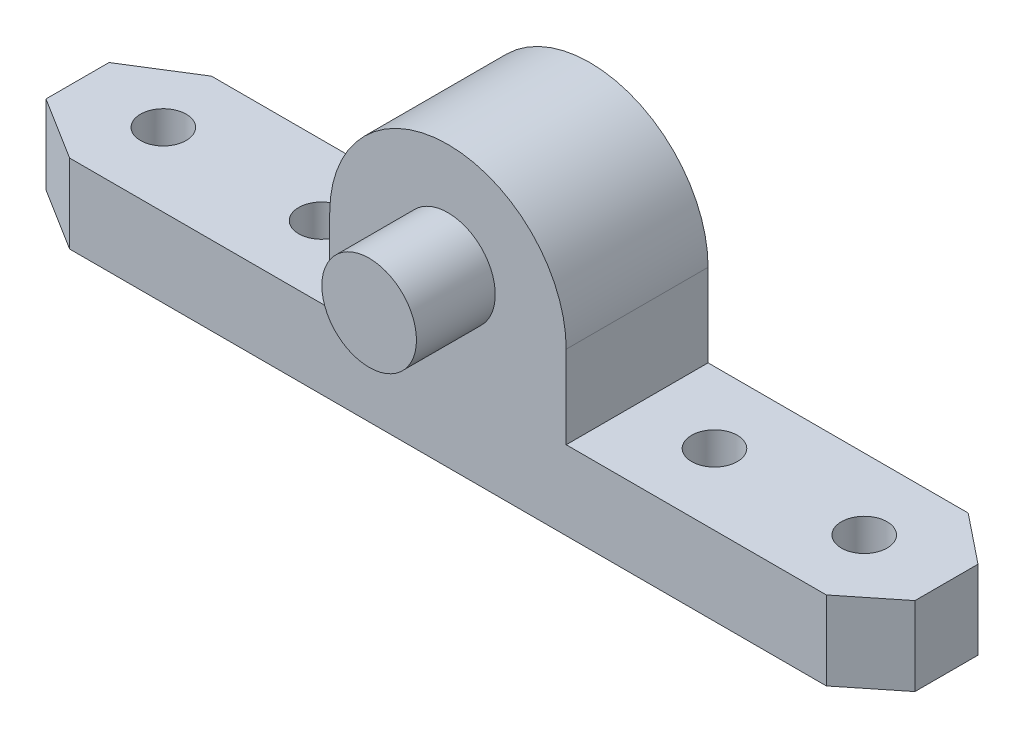
ISO-10303-21;
HEADER;
FILE_DESCRIPTION(('STEP AP214'),'2;1');
FILE_NAME('part.step','',(''),(''),'','','');
FILE_SCHEMA(('AUTOMOTIVE_DESIGN { 1 0 10303 214 1 1 1 1 }'));
ENDSEC;
DATA;
#1=APPLICATION_CONTEXT('core data for automotive mechanical design processes');
#2=APPLICATION_PROTOCOL_DEFINITION('international standard','automotive_design',2000,#1);
#3=PRODUCT_CONTEXT('',#1,'mechanical');
#4=PRODUCT('Part','Part','',(#3));
#5=PRODUCT_RELATED_PRODUCT_CATEGORY('part','',(#4));
#6=PRODUCT_DEFINITION_FORMATION('','',#4);
#7=PRODUCT_DEFINITION_CONTEXT('part definition',#1,'design');
#8=PRODUCT_DEFINITION('design','',#6,#7);
#9=PRODUCT_DEFINITION_SHAPE('','',#8);
#10=(LENGTH_UNIT() NAMED_UNIT(*) SI_UNIT(.MILLI.,.METRE.));
#11=(NAMED_UNIT(*) PLANE_ANGLE_UNIT() SI_UNIT($,.RADIAN.));
#12=(NAMED_UNIT(*) SI_UNIT($,.STERADIAN.) SOLID_ANGLE_UNIT());
#13=UNCERTAINTY_MEASURE_WITH_UNIT(LENGTH_MEASURE(1.E-05),#10,'distance_accuracy_value','');
#14=(GEOMETRIC_REPRESENTATION_CONTEXT(3) GLOBAL_UNCERTAINTY_ASSIGNED_CONTEXT((#13)) GLOBAL_UNIT_ASSIGNED_CONTEXT((#10,
#11,#12)) REPRESENTATION_CONTEXT('',''));
#15=CARTESIAN_POINT('',(0.,0.,0.));
#16=DIRECTION('',(0.,0.,1.));
#17=DIRECTION('',(1.,0.,0.));
#18=AXIS2_PLACEMENT_3D('',#15,#16,#17);
#19=CARTESIAN_POINT('',(0.,5.,0.));
#20=DIRECTION('',(0.,-1.,0.));
#21=DIRECTION('',(0.,0.,-1.));
#22=AXIS2_PLACEMENT_3D('',#19,#20,#21);
#23=PLANE('',#22);
#24=CARTESIAN_POINT('',(-22.7160462296342,5.,-0.159099942734997));
#25=DIRECTION('',(0.,1.,0.));
#26=DIRECTION('',(0.,0.,1.));
#27=AXIS2_PLACEMENT_3D('',#24,#25,#26);
#28=CIRCLE('',#27,1.45);
#29=CARTESIAN_POINT('',(-22.7160462296342,5.,1.290900057265));
#30=VERTEX_POINT('',#29);
#31=EDGE_CURVE('E285',#30,#30,#28,.T.);
#32=ORIENTED_EDGE('',*,*,#31,.F.);
#33=EDGE_LOOP('',(#32));
#34=FACE_BOUND('',#33,.T.);
#35=CARTESIAN_POINT('',(-12.5720154098781,5.,-0.0530333142449984));
#36=DIRECTION('',(0.,1.,0.));
#37=DIRECTION('',(0.,0.,1.));
#38=AXIS2_PLACEMENT_3D('',#35,#36,#37);
#39=CIRCLE('',#38,1.45);
#40=CARTESIAN_POINT('',(-12.5720154098781,5.,1.396966685755));
#41=VERTEX_POINT('',#40);
#42=EDGE_CURVE('E289',#41,#41,#39,.T.);
#43=ORIENTED_EDGE('',*,*,#42,.F.);
#44=EDGE_LOOP('',(#43));
#45=FACE_BOUND('',#44,.T.);
#46=DIRECTION('',(0.,0.,1.));
#47=VECTOR('',#46,1.);
#48=CARTESIAN_POINT('',(-7.49999999999999,5.,-4.5));
#49=LINE('',#48,#47);
#50=CARTESIAN_POINT('',(-7.49999999999999,5.,-4.5));
#51=VERTEX_POINT('',#50);
#52=CARTESIAN_POINT('',(-7.49999999999999,5.,4.5));
#53=VERTEX_POINT('',#52);
#54=EDGE_CURVE('E243',#51,#53,#49,.T.);
#55=ORIENTED_EDGE('',*,*,#54,.F.);
#56=DIRECTION('',(-1.,0.,0.));
#57=VECTOR('',#56,1.);
#58=CARTESIAN_POINT('',(-24.,5.,-4.5));
#59=LINE('',#58,#57);
#60=CARTESIAN_POINT('',(-24.,5.,-4.5));
#61=VERTEX_POINT('',#60);
#62=EDGE_CURVE('E112',#51,#61,#59,.T.);
#63=ORIENTED_EDGE('',*,*,#62,.T.);
#64=DIRECTION('',(-0.847998304005088,0.,0.52999894000318));
#65=VECTOR('',#64,1.);
#66=CARTESIAN_POINT('',(-24.,5.,-4.5));
#67=LINE('',#66,#65);
#68=CARTESIAN_POINT('',(-28.,5.,-1.99999999999999));
#69=VERTEX_POINT('',#68);
#70=EDGE_CURVE('E257',#61,#69,#67,.T.);
#71=ORIENTED_EDGE('',*,*,#70,.T.);
#72=DIRECTION('',(0.,0.,1.));
#73=VECTOR('',#72,1.);
#74=CARTESIAN_POINT('',(-28.,5.,-1.99999999999999));
#75=LINE('',#74,#73);
#76=CARTESIAN_POINT('',(-28.,5.,2.));
#77=VERTEX_POINT('',#76);
#78=EDGE_CURVE('E260',#69,#77,#75,.T.);
#79=ORIENTED_EDGE('',*,*,#78,.T.);
#80=DIRECTION('',(0.847998304005088,0.,0.529998940003179));
#81=VECTOR('',#80,1.);
#82=CARTESIAN_POINT('',(-28.,5.,2.));
#83=LINE('',#82,#81);
#84=CARTESIAN_POINT('',(-24.,5.,4.5));
#85=VERTEX_POINT('',#84);
#86=EDGE_CURVE('E263',#77,#85,#83,.T.);
#87=ORIENTED_EDGE('',*,*,#86,.T.);
#88=DIRECTION('',(1.,0.,0.));
#89=VECTOR('',#88,1.);
#90=CARTESIAN_POINT('',(-24.,5.,4.5));
#91=LINE('',#90,#89);
#92=EDGE_CURVE('E141',#85,#53,#91,.T.);
#93=ORIENTED_EDGE('',*,*,#92,.T.);
#94=EDGE_LOOP('',(#55,#63,#71,#79,#87,#93));
#95=FACE_BOUND('',#94,.T.);
#96=ADVANCED_FACE('F45',(#34,#45,#95),#23,.F.);
#97=CARTESIAN_POINT('',(-24.,5.,-4.5));
#98=DIRECTION('',(0.,0.,1.));
#99=DIRECTION('',(1.,0.,0.));
#100=AXIS2_PLACEMENT_3D('',#97,#98,#99);
#101=PLANE('',#100);
#102=DIRECTION('',(-1.,0.,0.));
#103=VECTOR('',#102,1.);
#104=CARTESIAN_POINT('',(-24.,0.,-4.5));
#105=LINE('',#104,#103);
#106=CARTESIAN_POINT('',(24.,0.,-4.5));
#107=VERTEX_POINT('',#106);
#108=CARTESIAN_POINT('',(-24.,0.,-4.5));
#109=VERTEX_POINT('',#108);
#110=EDGE_CURVE('E162',#107,#109,#105,.T.);
#111=ORIENTED_EDGE('',*,*,#110,.T.);
#112=DIRECTION('',(0.,-1.,0.));
#113=VECTOR('',#112,1.);
#114=CARTESIAN_POINT('',(-24.,5.,-4.5));
#115=LINE('',#114,#113);
#116=EDGE_CURVE('E54',#61,#109,#115,.T.);
#117=ORIENTED_EDGE('',*,*,#116,.F.);
#118=ORIENTED_EDGE('',*,*,#62,.F.);
#119=DIRECTION('',(0.,-1.,0.));
#120=VECTOR('',#119,1.);
#121=CARTESIAN_POINT('',(-7.49999999999999,5.,-4.5));
#122=LINE('',#121,#120);
#123=CARTESIAN_POINT('',(-7.49999999999999,10.25,-4.5));
#124=VERTEX_POINT('',#123);
#125=EDGE_CURVE('E234',#124,#51,#122,.T.);
#126=ORIENTED_EDGE('',*,*,#125,.F.);
#127=CARTESIAN_POINT('',(0.,10.25,-4.5));
#128=DIRECTION('',(0.,0.,1.));
#129=DIRECTION('',(-1.,0.,0.));
#130=AXIS2_PLACEMENT_3D('',#127,#128,#129);
#131=CIRCLE('',#130,7.5);
#132=CARTESIAN_POINT('',(7.50000000000001,10.25,-4.5));
#133=VERTEX_POINT('',#132);
#134=EDGE_CURVE('E273',#133,#124,#131,.T.);
#135=ORIENTED_EDGE('',*,*,#134,.F.);
#136=DIRECTION('',(0.,1.,0.));
#137=VECTOR('',#136,1.);
#138=CARTESIAN_POINT('',(7.50000000000001,10.25,-4.5));
#139=LINE('',#138,#137);
#140=CARTESIAN_POINT('',(7.50000000000001,5.,-4.5));
#141=VERTEX_POINT('',#140);
#142=EDGE_CURVE('E240',#141,#133,#139,.T.);
#143=ORIENTED_EDGE('',*,*,#142,.F.);
#144=CARTESIAN_POINT('',(24.,5.,-4.5));
#145=VERTEX_POINT('',#144);
#146=EDGE_CURVE('E254',#145,#141,#59,.T.);
#147=ORIENTED_EDGE('',*,*,#146,.F.);
#148=DIRECTION('',(0.,-1.,0.));
#149=VECTOR('',#148,1.);
#150=CARTESIAN_POINT('',(24.,5.,-4.5));
#151=LINE('',#150,#149);
#152=EDGE_CURVE('E158',#145,#107,#151,.T.);
#153=ORIENTED_EDGE('',*,*,#152,.T.);
#154=EDGE_LOOP('',(#111,#117,#118,#126,#135,#143,#147,#153));
#155=FACE_BOUND('',#154,.T.);
#156=ADVANCED_FACE('F47',(#155),#101,.F.);
#157=CARTESIAN_POINT('',(-24.,5.,-4.5));
#158=DIRECTION('',(0.52999894000318,0.,0.847998304005088));
#159=DIRECTION('',(0.847998304005088,0.,-0.52999894000318));
#160=AXIS2_PLACEMENT_3D('',#157,#158,#159);
#161=PLANE('',#160);
#162=DIRECTION('',(-0.847998304005088,0.,0.52999894000318));
#163=VECTOR('',#162,1.);
#164=CARTESIAN_POINT('',(-24.,0.,-4.5));
#165=LINE('',#164,#163);
#166=CARTESIAN_POINT('',(-28.,0.,-1.99999999999999));
#167=VERTEX_POINT('',#166);
#168=EDGE_CURVE('E166',#109,#167,#165,.T.);
#169=ORIENTED_EDGE('',*,*,#168,.T.);
#170=DIRECTION('',(0.,-1.,0.));
#171=VECTOR('',#170,1.);
#172=CARTESIAN_POINT('',(-28.,5.,-1.99999999999999));
#173=LINE('',#172,#171);
#174=EDGE_CURVE('E200',#69,#167,#173,.T.);
#175=ORIENTED_EDGE('',*,*,#174,.F.);
#176=ORIENTED_EDGE('',*,*,#70,.F.);
#177=ORIENTED_EDGE('',*,*,#116,.T.);
#178=EDGE_LOOP('',(#169,#175,#176,#177));
#179=FACE_BOUND('',#178,.T.);
#180=ADVANCED_FACE('F362',(#179),#161,.F.);
#181=CARTESIAN_POINT('',(-28.,5.,-1.99999999999999));
#182=DIRECTION('',(1.,0.,0.));
#183=DIRECTION('',(0.,0.,-1.));
#184=AXIS2_PLACEMENT_3D('',#181,#182,#183);
#185=PLANE('',#184);
#186=DIRECTION('',(0.,0.,1.));
#187=VECTOR('',#186,1.);
#188=CARTESIAN_POINT('',(-28.,0.,-1.99999999999999));
#189=LINE('',#188,#187);
#190=CARTESIAN_POINT('',(-28.,0.,2.));
#191=VERTEX_POINT('',#190);
#192=EDGE_CURVE('E170',#167,#191,#189,.T.);
#193=ORIENTED_EDGE('',*,*,#192,.T.);
#194=DIRECTION('',(0.,-1.,0.));
#195=VECTOR('',#194,1.);
#196=CARTESIAN_POINT('',(-28.,5.,2.));
#197=LINE('',#196,#195);
#198=EDGE_CURVE('E196',#77,#191,#197,.T.);
#199=ORIENTED_EDGE('',*,*,#198,.F.);
#200=ORIENTED_EDGE('',*,*,#78,.F.);
#201=ORIENTED_EDGE('',*,*,#174,.T.);
#202=EDGE_LOOP('',(#193,#199,#200,#201));
#203=FACE_BOUND('',#202,.T.);
#204=ADVANCED_FACE('F487',(#203),#185,.F.);
#205=CARTESIAN_POINT('',(-28.,5.,2.));
#206=DIRECTION('',(0.529998940003179,0.,-0.847998304005088));
#207=DIRECTION('',(-0.847998304005088,0.,-0.529998940003179));
#208=AXIS2_PLACEMENT_3D('',#205,#206,#207);
#209=PLANE('',#208);
#210=DIRECTION('',(0.847998304005088,0.,0.529998940003179));
#211=VECTOR('',#210,1.);
#212=CARTESIAN_POINT('',(-28.,0.,2.));
#213=LINE('',#212,#211);
#214=CARTESIAN_POINT('',(-24.,0.,4.5));
#215=VERTEX_POINT('',#214);
#216=EDGE_CURVE('E173',#191,#215,#213,.T.);
#217=ORIENTED_EDGE('',*,*,#216,.T.);
#218=DIRECTION('',(0.,-1.,0.));
#219=VECTOR('',#218,1.);
#220=CARTESIAN_POINT('',(-24.,5.,4.5));
#221=LINE('',#220,#219);
#222=EDGE_CURVE('E192',#85,#215,#221,.T.);
#223=ORIENTED_EDGE('',*,*,#222,.F.);
#224=ORIENTED_EDGE('',*,*,#86,.F.);
#225=ORIENTED_EDGE('',*,*,#198,.T.);
#226=EDGE_LOOP('',(#217,#223,#224,#225));
#227=FACE_BOUND('',#226,.T.);
#228=ADVANCED_FACE('F312',(#227),#209,.F.);
#229=CARTESIAN_POINT('',(-24.,5.,4.5));
#230=DIRECTION('',(0.,0.,-1.));
#231=DIRECTION('',(-1.,0.,0.));
#232=AXIS2_PLACEMENT_3D('',#229,#230,#231);
#233=PLANE('',#232);
#234=CARTESIAN_POINT('',(0.,11.,4.5));
#235=DIRECTION('',(0.,0.,-1.));
#236=DIRECTION('',(-1.,0.,0.));
#237=AXIS2_PLACEMENT_3D('',#234,#235,#236);
#238=CIRCLE('',#237,3.);
#239=CARTESIAN_POINT('',(-3.,11.,4.5));
#240=VERTEX_POINT('',#239);
#241=EDGE_CURVE('E11',#240,#240,#238,.F.);
#242=ORIENTED_EDGE('',*,*,#241,.F.);
#243=EDGE_LOOP('',(#242));
#244=FACE_BOUND('',#243,.T.);
#245=DIRECTION('',(1.,0.,0.));
#246=VECTOR('',#245,1.);
#247=CARTESIAN_POINT('',(-24.,0.,4.5));
#248=LINE('',#247,#246);
#249=CARTESIAN_POINT('',(24.,0.,4.5));
#250=VERTEX_POINT('',#249);
#251=EDGE_CURVE('E176',#215,#250,#248,.T.);
#252=ORIENTED_EDGE('',*,*,#251,.T.);
#253=DIRECTION('',(0.,-1.,0.));
#254=VECTOR('',#253,1.);
#255=CARTESIAN_POINT('',(24.,5.,4.5));
#256=LINE('',#255,#254);
#257=CARTESIAN_POINT('',(24.,5.,4.5));
#258=VERTEX_POINT('',#257);
#259=EDGE_CURVE('E151',#258,#250,#256,.T.);
#260=ORIENTED_EDGE('',*,*,#259,.F.);
#261=CARTESIAN_POINT('',(7.50000000000001,5.,4.5));
#262=VERTEX_POINT('',#261);
#263=EDGE_CURVE('E136',#262,#258,#91,.T.);
#264=ORIENTED_EDGE('',*,*,#263,.F.);
#265=DIRECTION('',(0.,1.,0.));
#266=VECTOR('',#265,1.);
#267=CARTESIAN_POINT('',(7.50000000000001,10.25,4.5));
#268=LINE('',#267,#266);
#269=CARTESIAN_POINT('',(7.50000000000001,10.25,4.5));
#270=VERTEX_POINT('',#269);
#271=EDGE_CURVE('E61',#262,#270,#268,.T.);
#272=ORIENTED_EDGE('',*,*,#271,.T.);
#273=CARTESIAN_POINT('',(0.,10.25,4.5));
#274=DIRECTION('',(0.,0.,1.));
#275=DIRECTION('',(-1.,0.,0.));
#276=AXIS2_PLACEMENT_3D('',#273,#274,#275);
#277=CIRCLE('',#276,7.5);
#278=CARTESIAN_POINT('',(-7.49999999999999,10.25,4.5));
#279=VERTEX_POINT('',#278);
#280=EDGE_CURVE('E225',#270,#279,#277,.T.);
#281=ORIENTED_EDGE('',*,*,#280,.T.);
#282=DIRECTION('',(0.,-1.,0.));
#283=VECTOR('',#282,1.);
#284=CARTESIAN_POINT('',(-7.49999999999999,5.,4.5));
#285=LINE('',#284,#283);
#286=EDGE_CURVE('E231',#279,#53,#285,.T.);
#287=ORIENTED_EDGE('',*,*,#286,.T.);
#288=ORIENTED_EDGE('',*,*,#92,.F.);
#289=ORIENTED_EDGE('',*,*,#222,.T.);
#290=EDGE_LOOP('',(#252,#260,#264,#272,#281,#287,#288,#289));
#291=FACE_BOUND('',#290,.T.);
#292=ADVANCED_FACE('F310',(#244,#291),#233,.F.);
#293=CARTESIAN_POINT('',(27.1224989991992,5.,2.));
#294=DIRECTION('',(-0.625,0.,-0.7806247497998));
#295=DIRECTION('',(-0.7806247497998,0.,0.625));
#296=AXIS2_PLACEMENT_3D('',#293,#294,#295);
#297=PLANE('',#296);
#298=DIRECTION('',(0.7806247497998,0.,-0.625));
#299=VECTOR('',#298,1.);
#300=CARTESIAN_POINT('',(27.1224989991992,0.,2.));
#301=LINE('',#300,#299);
#302=CARTESIAN_POINT('',(27.1224989991992,0.,2.));
#303=VERTEX_POINT('',#302);
#304=EDGE_CURVE('E147',#250,#303,#301,.T.);
#305=ORIENTED_EDGE('',*,*,#304,.T.);
#306=DIRECTION('',(0.,-1.,0.));
#307=VECTOR('',#306,1.);
#308=CARTESIAN_POINT('',(27.1224989991992,5.,2.));
#309=LINE('',#308,#307);
#310=CARTESIAN_POINT('',(27.1224989991992,5.,2.));
#311=VERTEX_POINT('',#310);
#312=EDGE_CURVE('E144',#311,#303,#309,.T.);
#313=ORIENTED_EDGE('',*,*,#312,.F.);
#314=DIRECTION('',(0.7806247497998,0.,-0.625));
#315=VECTOR('',#314,1.);
#316=CARTESIAN_POINT('',(27.1224989991992,5.,2.));
#317=LINE('',#316,#315);
#318=EDGE_CURVE('E129',#258,#311,#317,.T.);
#319=ORIENTED_EDGE('',*,*,#318,.F.);
#320=ORIENTED_EDGE('',*,*,#259,.T.);
#321=EDGE_LOOP('',(#305,#313,#319,#320));
#322=FACE_BOUND('',#321,.T.);
#323=ADVANCED_FACE('F145',(#322),#297,.F.);
#324=CARTESIAN_POINT('',(27.1224989991992,5.,-2.));
#325=DIRECTION('',(-1.,0.,0.));
#326=DIRECTION('',(0.,0.,1.));
#327=AXIS2_PLACEMENT_3D('',#324,#325,#326);
#328=PLANE('',#327);
#329=DIRECTION('',(0.,0.,-1.));
#330=VECTOR('',#329,1.);
#331=CARTESIAN_POINT('',(27.1224989991992,0.,-2.));
#332=LINE('',#331,#330);
#333=CARTESIAN_POINT('',(27.1224989991992,0.,-2.));
#334=VERTEX_POINT('',#333);
#335=EDGE_CURVE('E181',#303,#334,#332,.T.);
#336=ORIENTED_EDGE('',*,*,#335,.T.);
#337=DIRECTION('',(0.,-1.,0.));
#338=VECTOR('',#337,1.);
#339=CARTESIAN_POINT('',(27.1224989991992,5.,-2.));
#340=LINE('',#339,#338);
#341=CARTESIAN_POINT('',(27.1224989991992,5.,-2.));
#342=VERTEX_POINT('',#341);
#343=EDGE_CURVE('E152',#342,#334,#340,.T.);
#344=ORIENTED_EDGE('',*,*,#343,.F.);
#345=DIRECTION('',(0.,0.,-1.));
#346=VECTOR('',#345,1.);
#347=CARTESIAN_POINT('',(27.1224989991992,5.,-2.));
#348=LINE('',#347,#346);
#349=EDGE_CURVE('E133',#311,#342,#348,.T.);
#350=ORIENTED_EDGE('',*,*,#349,.F.);
#351=ORIENTED_EDGE('',*,*,#312,.T.);
#352=EDGE_LOOP('',(#336,#344,#350,#351));
#353=FACE_BOUND('',#352,.T.);
#354=ADVANCED_FACE('F154',(#353),#328,.F.);
#355=CARTESIAN_POINT('',(24.,5.,-4.5));
#356=DIRECTION('',(-0.625,0.,0.7806247497998));
#357=DIRECTION('',(0.7806247497998,0.,0.625));
#358=AXIS2_PLACEMENT_3D('',#355,#356,#357);
#359=PLANE('',#358);
#360=DIRECTION('',(-0.7806247497998,0.,-0.625));
#361=VECTOR('',#360,1.);
#362=CARTESIAN_POINT('',(24.,0.,-4.5));
#363=LINE('',#362,#361);
#364=EDGE_CURVE('E103',#334,#107,#363,.T.);
#365=ORIENTED_EDGE('',*,*,#364,.T.);
#366=ORIENTED_EDGE('',*,*,#152,.F.);
#367=DIRECTION('',(-0.7806247497998,0.,-0.625));
#368=VECTOR('',#367,1.);
#369=CARTESIAN_POINT('',(24.,5.,-4.5));
#370=LINE('',#369,#368);
#371=EDGE_CURVE('E70',#342,#145,#370,.T.);
#372=ORIENTED_EDGE('',*,*,#371,.F.);
#373=ORIENTED_EDGE('',*,*,#343,.T.);
#374=EDGE_LOOP('',(#365,#366,#372,#373));
#375=FACE_BOUND('',#374,.T.);
#376=ADVANCED_FACE('F320',(#375),#359,.F.);
#377=CARTESIAN_POINT('',(21.9056247497998,5.,0.));
#378=DIRECTION('',(0.,1.,0.));
#379=DIRECTION('',(0.,0.,1.));
#380=AXIS2_PLACEMENT_3D('',#377,#378,#379);
#381=CIRCLE('',#380,1.45);
#382=CARTESIAN_POINT('',(21.9056247497998,5.,1.45));
#383=VERTEX_POINT('',#382);
#384=EDGE_CURVE('E284',#383,#383,#381,.T.);
#385=ORIENTED_EDGE('',*,*,#384,.F.);
#386=EDGE_LOOP('',(#385));
#387=FACE_BOUND('',#386,.T.);
#388=CARTESIAN_POINT('',(12.4056247497998,5.,0.));
#389=DIRECTION('',(0.,1.,0.));
#390=DIRECTION('',(0.,0.,1.));
#391=AXIS2_PLACEMENT_3D('',#388,#389,#390);
#392=CIRCLE('',#391,1.45);
#393=CARTESIAN_POINT('',(12.4056247497998,5.,1.45));
#394=VERTEX_POINT('',#393);
#395=EDGE_CURVE('E212',#394,#394,#392,.T.);
#396=ORIENTED_EDGE('',*,*,#395,.F.);
#397=EDGE_LOOP('',(#396));
#398=FACE_BOUND('',#397,.T.);
#399=ORIENTED_EDGE('',*,*,#146,.T.);
#400=DIRECTION('',(0.,0.,1.));
#401=VECTOR('',#400,1.);
#402=CARTESIAN_POINT('',(7.50000000000001,5.,-4.5));
#403=LINE('',#402,#401);
#404=EDGE_CURVE('E167',#141,#262,#403,.T.);
#405=ORIENTED_EDGE('',*,*,#404,.T.);
#406=ORIENTED_EDGE('',*,*,#263,.T.);
#407=ORIENTED_EDGE('',*,*,#318,.T.);
#408=ORIENTED_EDGE('',*,*,#349,.T.);
#409=ORIENTED_EDGE('',*,*,#371,.T.);
#410=EDGE_LOOP('',(#399,#405,#406,#407,#408,#409));
#411=FACE_BOUND('',#410,.T.);
#412=ADVANCED_FACE('F131',(#387,#398,#411),#23,.F.);
#413=CARTESIAN_POINT('',(0.,0.,0.));
#414=DIRECTION('',(0.,-1.,0.));
#415=DIRECTION('',(0.,0.,-1.));
#416=AXIS2_PLACEMENT_3D('',#413,#414,#415);
#417=PLANE('',#416);
#418=CARTESIAN_POINT('',(-22.7160462296342,0.,-0.159099942734997));
#419=DIRECTION('',(0.,-1.,0.));
#420=DIRECTION('',(0.,0.,-1.));
#421=AXIS2_PLACEMENT_3D('',#418,#419,#420);
#422=CIRCLE('',#421,1.45);
#423=CARTESIAN_POINT('',(-22.7160462296342,0.,-1.609099942735));
#424=VERTEX_POINT('',#423);
#425=EDGE_CURVE('E219',#424,#424,#422,.T.);
#426=ORIENTED_EDGE('',*,*,#425,.F.);
#427=EDGE_LOOP('',(#426));
#428=FACE_BOUND('',#427,.T.);
#429=CARTESIAN_POINT('',(-12.5720154098781,0.,-0.0530333142449984));
#430=DIRECTION('',(0.,-1.,0.));
#431=DIRECTION('',(0.,0.,-1.));
#432=AXIS2_PLACEMENT_3D('',#429,#430,#431);
#433=CIRCLE('',#432,1.45);
#434=CARTESIAN_POINT('',(-12.5720154098781,0.,-1.503033314245));
#435=VERTEX_POINT('',#434);
#436=EDGE_CURVE('E216',#435,#435,#433,.T.);
#437=ORIENTED_EDGE('',*,*,#436,.F.);
#438=EDGE_LOOP('',(#437));
#439=FACE_BOUND('',#438,.T.);
#440=CARTESIAN_POINT('',(21.9056247497998,0.,0.));
#441=DIRECTION('',(0.,-1.,0.));
#442=DIRECTION('',(0.,0.,-1.));
#443=AXIS2_PLACEMENT_3D('',#440,#441,#442);
#444=CIRCLE('',#443,1.45);
#445=CARTESIAN_POINT('',(21.9056247497998,0.,-1.45));
#446=VERTEX_POINT('',#445);
#447=EDGE_CURVE('E211',#446,#446,#444,.T.);
#448=ORIENTED_EDGE('',*,*,#447,.F.);
#449=EDGE_LOOP('',(#448));
#450=FACE_BOUND('',#449,.T.);
#451=CARTESIAN_POINT('',(12.4056247497998,0.,0.));
#452=DIRECTION('',(0.,-1.,0.));
#453=DIRECTION('',(0.,0.,-1.));
#454=AXIS2_PLACEMENT_3D('',#451,#452,#453);
#455=CIRCLE('',#454,1.45);
#456=CARTESIAN_POINT('',(12.4056247497998,0.,-1.45));
#457=VERTEX_POINT('',#456);
#458=EDGE_CURVE('E207',#457,#457,#455,.T.);
#459=ORIENTED_EDGE('',*,*,#458,.F.);
#460=EDGE_LOOP('',(#459));
#461=FACE_BOUND('',#460,.T.);
#462=ORIENTED_EDGE('',*,*,#110,.F.);
#463=ORIENTED_EDGE('',*,*,#364,.F.);
#464=ORIENTED_EDGE('',*,*,#335,.F.);
#465=ORIENTED_EDGE('',*,*,#304,.F.);
#466=ORIENTED_EDGE('',*,*,#251,.F.);
#467=ORIENTED_EDGE('',*,*,#216,.F.);
#468=ORIENTED_EDGE('',*,*,#192,.F.);
#469=ORIENTED_EDGE('',*,*,#168,.F.);
#470=EDGE_LOOP('',(#462,#463,#464,#465,#466,#467,#468,#469));
#471=FACE_BOUND('',#470,.T.);
#472=ADVANCED_FACE('F319',(#428,#439,#450,#461,#471),#417,.T.);
#473=CARTESIAN_POINT('',(7.50000000000001,10.25,-4.5));
#474=DIRECTION('',(1.,0.,0.));
#475=DIRECTION('',(0.,1.,0.));
#476=AXIS2_PLACEMENT_3D('',#473,#474,#475);
#477=PLANE('',#476);
#478=ORIENTED_EDGE('',*,*,#271,.F.);
#479=ORIENTED_EDGE('',*,*,#404,.F.);
#480=ORIENTED_EDGE('',*,*,#142,.T.);
#481=DIRECTION('',(0.,0.,1.));
#482=VECTOR('',#481,1.);
#483=CARTESIAN_POINT('',(7.50000000000001,10.25,-4.5));
#484=LINE('',#483,#482);
#485=EDGE_CURVE('E251',#133,#270,#484,.T.);
#486=ORIENTED_EDGE('',*,*,#485,.T.);
#487=EDGE_LOOP('',(#478,#479,#480,#486));
#488=FACE_BOUND('',#487,.T.);
#489=ADVANCED_FACE('F353',(#488),#477,.T.);
#490=CARTESIAN_POINT('',(-7.49999999999999,5.,-4.5));
#491=DIRECTION('',(-1.,0.,0.));
#492=DIRECTION('',(0.,0.,1.));
#493=AXIS2_PLACEMENT_3D('',#490,#491,#492);
#494=PLANE('',#493);
#495=ORIENTED_EDGE('',*,*,#286,.F.);
#496=DIRECTION('',(0.,0.,1.));
#497=VECTOR('',#496,1.);
#498=CARTESIAN_POINT('',(-7.49999999999999,10.25,-4.5));
#499=LINE('',#498,#497);
#500=EDGE_CURVE('E247',#124,#279,#499,.T.);
#501=ORIENTED_EDGE('',*,*,#500,.F.);
#502=ORIENTED_EDGE('',*,*,#125,.T.);
#503=ORIENTED_EDGE('',*,*,#54,.T.);
#504=EDGE_LOOP('',(#495,#501,#502,#503));
#505=FACE_BOUND('',#504,.T.);
#506=ADVANCED_FACE('F339',(#505),#494,.T.);
#507=CARTESIAN_POINT('',(0.,10.25,-4.5));
#508=DIRECTION('',(0.,0.,1.));
#509=DIRECTION('',(1.,0.,0.));
#510=AXIS2_PLACEMENT_3D('',#507,#508,#509);
#511=CYLINDRICAL_SURFACE('',#510,7.5);
#512=ORIENTED_EDGE('',*,*,#280,.F.);
#513=ORIENTED_EDGE('',*,*,#485,.F.);
#514=ORIENTED_EDGE('',*,*,#134,.T.);
#515=ORIENTED_EDGE('',*,*,#500,.T.);
#516=EDGE_LOOP('',(#512,#513,#514,#515));
#517=FACE_BOUND('',#516,.T.);
#518=ADVANCED_FACE('F341',(#517),#511,.T.);
#519=CARTESIAN_POINT('',(12.4056247497998,-1.,0.));
#520=DIRECTION('',(0.,1.,0.));
#521=DIRECTION('',(0.,0.,1.));
#522=AXIS2_PLACEMENT_3D('',#519,#520,#521);
#523=CYLINDRICAL_SURFACE('',#522,1.45);
#524=ORIENTED_EDGE('',*,*,#458,.T.);
#525=EDGE_LOOP('',(#524));
#526=FACE_BOUND('',#525,.T.);
#527=ORIENTED_EDGE('',*,*,#395,.T.);
#528=EDGE_LOOP('',(#527));
#529=FACE_BOUND('',#528,.T.);
#530=ADVANCED_FACE('F343',(#526,#529),#523,.F.);
#531=CARTESIAN_POINT('',(21.9056247497998,-1.,0.));
#532=DIRECTION('',(0.,1.,0.));
#533=DIRECTION('',(0.,0.,1.));
#534=AXIS2_PLACEMENT_3D('',#531,#532,#533);
#535=CYLINDRICAL_SURFACE('',#534,1.45);
#536=ORIENTED_EDGE('',*,*,#447,.T.);
#537=EDGE_LOOP('',(#536));
#538=FACE_BOUND('',#537,.T.);
#539=ORIENTED_EDGE('',*,*,#384,.T.);
#540=EDGE_LOOP('',(#539));
#541=FACE_BOUND('',#540,.T.);
#542=ADVANCED_FACE('F350',(#538,#541),#535,.F.);
#543=CARTESIAN_POINT('',(-12.5720154098781,-1.,-0.0530333142449984));
#544=DIRECTION('',(0.,1.,0.));
#545=DIRECTION('',(0.,0.,1.));
#546=AXIS2_PLACEMENT_3D('',#543,#544,#545);
#547=CYLINDRICAL_SURFACE('',#546,1.45);
#548=ORIENTED_EDGE('',*,*,#436,.T.);
#549=EDGE_LOOP('',(#548));
#550=FACE_BOUND('',#549,.T.);
#551=ORIENTED_EDGE('',*,*,#42,.T.);
#552=EDGE_LOOP('',(#551));
#553=FACE_BOUND('',#552,.T.);
#554=ADVANCED_FACE('F379',(#550,#553),#547,.F.);
#555=CARTESIAN_POINT('',(-22.7160462296342,-1.,-0.159099942734997));
#556=DIRECTION('',(0.,1.,0.));
#557=DIRECTION('',(0.,0.,1.));
#558=AXIS2_PLACEMENT_3D('',#555,#556,#557);
#559=CYLINDRICAL_SURFACE('',#558,1.45);
#560=ORIENTED_EDGE('',*,*,#425,.T.);
#561=EDGE_LOOP('',(#560));
#562=FACE_BOUND('',#561,.T.);
#563=ORIENTED_EDGE('',*,*,#31,.T.);
#564=EDGE_LOOP('',(#563));
#565=FACE_BOUND('',#564,.T.);
#566=ADVANCED_FACE('F306',(#562,#565),#559,.F.);
#567=CARTESIAN_POINT('',(0.,11.,9.5));
#568=DIRECTION('',(0.,0.,-1.));
#569=DIRECTION('',(-1.,0.,0.));
#570=AXIS2_PLACEMENT_3D('',#567,#568,#569);
#571=CYLINDRICAL_SURFACE('',#570,3.);
#572=CARTESIAN_POINT('',(0.,11.,9.5));
#573=DIRECTION('',(0.,0.,1.));
#574=DIRECTION('',(1.,0.,0.));
#575=AXIS2_PLACEMENT_3D('',#572,#573,#574);
#576=CIRCLE('',#575,3.);
#577=CARTESIAN_POINT('',(3.,11.,9.5));
#578=VERTEX_POINT('',#577);
#579=EDGE_CURVE('E290',#578,#578,#576,.T.);
#580=ORIENTED_EDGE('',*,*,#579,.F.);
#581=EDGE_LOOP('',(#580));
#582=FACE_BOUND('',#581,.T.);
#583=ORIENTED_EDGE('',*,*,#241,.T.);
#584=EDGE_LOOP('',(#583));
#585=FACE_BOUND('',#584,.T.);
#586=ADVANCED_FACE('F303',(#582,#585),#571,.T.);
#587=CARTESIAN_POINT('',(0.,11.,9.5));
#588=DIRECTION('',(0.,0.,1.));
#589=DIRECTION('',(1.,0.,0.));
#590=AXIS2_PLACEMENT_3D('',#587,#588,#589);
#591=PLANE('',#590);
#592=ORIENTED_EDGE('',*,*,#579,.T.);
#593=EDGE_LOOP('',(#592));
#594=FACE_BOUND('',#593,.T.);
#595=ADVANCED_FACE('F301',(#594),#591,.T.);
#596=CLOSED_SHELL('',(#96,#156,#180,#204,#228,#292,#323,#354,#376,#412,#472,#489,#506,#518,#530,
#542,#554,#566,#586,#595));
#597=MANIFOLD_SOLID_BREP('B2',#596);
#598=ADVANCED_BREP_SHAPE_REPRESENTATION('',(#18,#597),#14);
#599=SHAPE_DEFINITION_REPRESENTATION(#9,#598);
ENDSEC;
END-ISO-10303-21;
